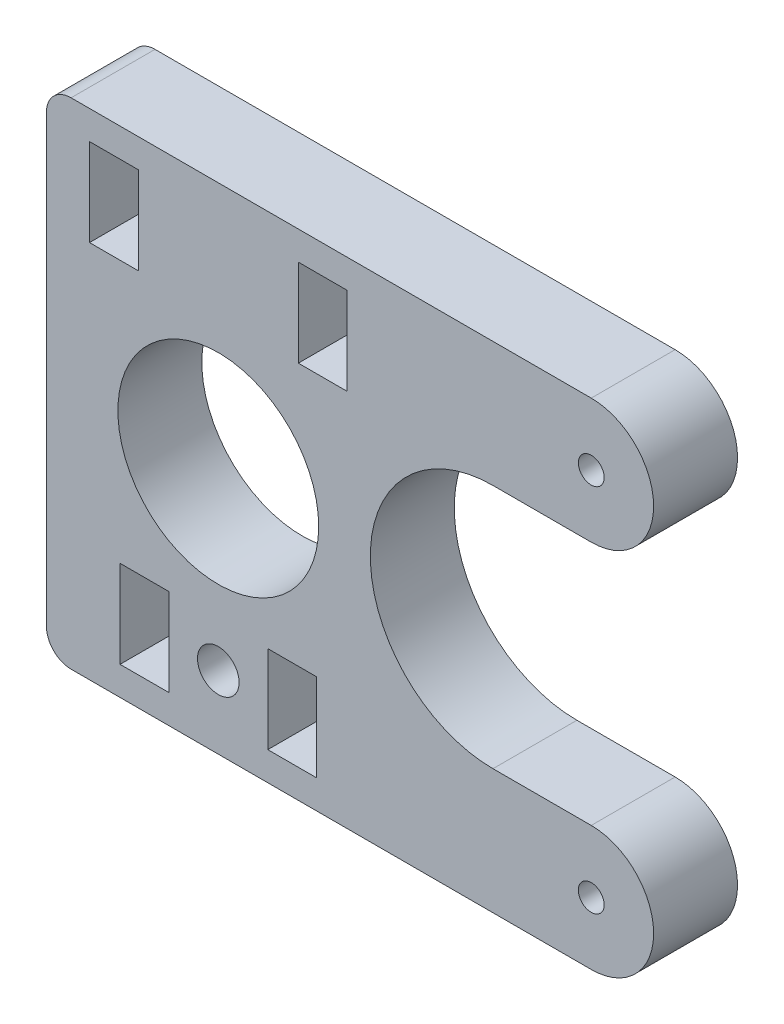
ISO-10303-21;
HEADER;
FILE_DESCRIPTION(('STEP AP214'),'2;1');
FILE_NAME('part.step','',(''),(''),'','','');
FILE_SCHEMA(('AUTOMOTIVE_DESIGN { 1 0 10303 214 1 1 1 1 }'));
ENDSEC;
DATA;
#1=APPLICATION_CONTEXT('core data for automotive mechanical design processes');
#2=APPLICATION_PROTOCOL_DEFINITION('international standard','automotive_design',2000,#1);
#3=PRODUCT_CONTEXT('',#1,'mechanical');
#4=PRODUCT('Part','Part','',(#3));
#5=PRODUCT_RELATED_PRODUCT_CATEGORY('part','',(#4));
#6=PRODUCT_DEFINITION_FORMATION('','',#4);
#7=PRODUCT_DEFINITION_CONTEXT('part definition',#1,'design');
#8=PRODUCT_DEFINITION('design','',#6,#7);
#9=PRODUCT_DEFINITION_SHAPE('','',#8);
#10=(LENGTH_UNIT() NAMED_UNIT(*) SI_UNIT(.MILLI.,.METRE.));
#11=(NAMED_UNIT(*) PLANE_ANGLE_UNIT() SI_UNIT($,.RADIAN.));
#12=(NAMED_UNIT(*) SI_UNIT($,.STERADIAN.) SOLID_ANGLE_UNIT());
#13=UNCERTAINTY_MEASURE_WITH_UNIT(LENGTH_MEASURE(1.E-05),#10,'distance_accuracy_value','');
#14=(GEOMETRIC_REPRESENTATION_CONTEXT(3) GLOBAL_UNCERTAINTY_ASSIGNED_CONTEXT((#13)) GLOBAL_UNIT_ASSIGNED_CONTEXT((#10,
#11,#12)) REPRESENTATION_CONTEXT('',''));
#15=CARTESIAN_POINT('',(0.,0.,0.));
#16=DIRECTION('',(0.,0.,1.));
#17=DIRECTION('',(1.,0.,0.));
#18=AXIS2_PLACEMENT_3D('',#15,#16,#17);
#19=CARTESIAN_POINT('',(684.72652137136,317.86545660983,5.85));
#20=DIRECTION('',(0.,0.,1.));
#21=DIRECTION('',(1.,0.,0.));
#22=AXIS2_PLACEMENT_3D('',#19,#20,#21);
#23=PLANE('',#22);
#24=DIRECTION('',(0.,1.,0.));
#25=VECTOR('',#24,1.);
#26=CARTESIAN_POINT('',(667.70653237136,339.91545660983,5.85));
#27=LINE('',#26,#25);
#28=CARTESIAN_POINT('',(667.70653237136,339.91545660983,5.85));
#29=VERTEX_POINT('',#28);
#30=CARTESIAN_POINT('',(667.70653237136,346.01545660983,5.85));
#31=VERTEX_POINT('',#30);
#32=EDGE_CURVE('E244',#29,#31,#27,.T.);
#33=ORIENTED_EDGE('',*,*,#32,.F.);
#34=DIRECTION('',(1.,0.,0.));
#35=VECTOR('',#34,1.);
#36=CARTESIAN_POINT('',(664.30652137136,339.91545660983,5.85));
#37=LINE('',#36,#35);
#38=CARTESIAN_POINT('',(664.30652137136,339.91545660983,5.85));
#39=VERTEX_POINT('',#38);
#40=EDGE_CURVE('E242',#39,#29,#37,.T.);
#41=ORIENTED_EDGE('',*,*,#40,.F.);
#42=DIRECTION('',(0.,-1.,0.));
#43=VECTOR('',#42,1.);
#44=CARTESIAN_POINT('',(664.30652137136,346.01545660983,5.85));
#45=LINE('',#44,#43);
#46=CARTESIAN_POINT('',(664.30652137136,346.01545660983,5.85));
#47=VERTEX_POINT('',#46);
#48=EDGE_CURVE('E250',#47,#39,#45,.T.);
#49=ORIENTED_EDGE('',*,*,#48,.F.);
#50=DIRECTION('',(-1.,0.,0.));
#51=VECTOR('',#50,1.);
#52=CARTESIAN_POINT('',(667.70653237136,346.01545660983,5.85));
#53=LINE('',#52,#51);
#54=EDGE_CURVE('E247',#31,#47,#53,.T.);
#55=ORIENTED_EDGE('',*,*,#54,.F.);
#56=EDGE_LOOP('',(#33,#41,#49,#55));
#57=FACE_BOUND('',#56,.T.);
#58=DIRECTION('',(0.,1.,0.));
#59=VECTOR('',#58,1.);
#60=CARTESIAN_POINT('',(653.14652137136,339.91545660983,5.85));
#61=LINE('',#60,#59);
#62=CARTESIAN_POINT('',(653.14652137136,339.91545660983,5.85));
#63=VERTEX_POINT('',#62);
#64=CARTESIAN_POINT('',(653.14652137136,346.01545660983,5.85));
#65=VERTEX_POINT('',#64);
#66=EDGE_CURVE('E306',#63,#65,#61,.T.);
#67=ORIENTED_EDGE('',*,*,#66,.F.);
#68=DIRECTION('',(1.,0.,0.));
#69=VECTOR('',#68,1.);
#70=CARTESIAN_POINT('',(649.74651037136,339.91545660983,5.85));
#71=LINE('',#70,#69);
#72=CARTESIAN_POINT('',(649.74651037136,339.91545660983,5.85));
#73=VERTEX_POINT('',#72);
#74=EDGE_CURVE('E304',#73,#63,#71,.T.);
#75=ORIENTED_EDGE('',*,*,#74,.F.);
#76=DIRECTION('',(0.,-1.,0.));
#77=VECTOR('',#76,1.);
#78=CARTESIAN_POINT('',(649.74651037136,346.01545660983,5.85));
#79=LINE('',#78,#77);
#80=CARTESIAN_POINT('',(649.74651037136,346.01545660983,5.85));
#81=VERTEX_POINT('',#80);
#82=EDGE_CURVE('E312',#81,#73,#79,.T.);
#83=ORIENTED_EDGE('',*,*,#82,.F.);
#84=DIRECTION('',(-1.,0.,0.));
#85=VECTOR('',#84,1.);
#86=CARTESIAN_POINT('',(653.14652137136,346.01545660983,5.85));
#87=LINE('',#86,#85);
#88=EDGE_CURVE('E309',#65,#81,#87,.T.);
#89=ORIENTED_EDGE('',*,*,#88,.F.);
#90=EDGE_LOOP('',(#67,#75,#83,#89));
#91=FACE_BOUND('',#90,.T.);
#92=CARTESIAN_POINT('',(658.72652137136,330.76545660983,5.85));
#93=DIRECTION('',(0.,0.,1.));
#94=DIRECTION('',(1.,0.,0.));
#95=AXIS2_PLACEMENT_3D('',#92,#93,#94);
#96=CIRCLE('',#95,7.00000000000004);
#97=CARTESIAN_POINT('',(665.72652137136,330.76545660983,5.85));
#98=VERTEX_POINT('',#97);
#99=EDGE_CURVE('E341',#98,#98,#96,.T.);
#100=ORIENTED_EDGE('',*,*,#99,.F.);
#101=EDGE_LOOP('',(#100));
#102=FACE_BOUND('',#101,.T.);
#103=CARTESIAN_POINT('',(684.72652137136,343.66545660983,5.85));
#104=DIRECTION('',(0.,0.,1.));
#105=DIRECTION('',(1.,0.,0.));
#106=AXIS2_PLACEMENT_3D('',#103,#104,#105);
#107=CIRCLE('',#106,0.900000000000007);
#108=CARTESIAN_POINT('',(685.62652137136,343.66545660983,5.85));
#109=VERTEX_POINT('',#108);
#110=EDGE_CURVE('E353',#109,#109,#107,.T.);
#111=ORIENTED_EDGE('',*,*,#110,.F.);
#112=EDGE_LOOP('',(#111));
#113=FACE_BOUND('',#112,.T.);
#114=DIRECTION('',(1.,0.,0.));
#115=VECTOR('',#114,1.);
#116=CARTESIAN_POINT('',(669.216844170212,313.51545660983,5.85));
#117=LINE('',#116,#115);
#118=CARTESIAN_POINT('',(648.463811899796,313.51545660983,5.85));
#119=VERTEX_POINT('',#118);
#120=CARTESIAN_POINT('',(684.726521371375,313.51545660983,5.85));
#121=VERTEX_POINT('',#120);
#122=EDGE_CURVE('E359',#119,#121,#117,.T.);
#123=ORIENTED_EDGE('',*,*,#122,.T.);
#124=CARTESIAN_POINT('',(684.72652137136,317.86545660983,5.85));
#125=DIRECTION('',(0.,0.,1.));
#126=DIRECTION('',(1.,0.,0.));
#127=AXIS2_PLACEMENT_3D('',#124,#125,#126);
#128=CIRCLE('',#127,4.34999999999997);
#129=CARTESIAN_POINT('',(684.726521371376,322.21545660983,5.85));
#130=VERTEX_POINT('',#129);
#131=EDGE_CURVE('E362',#121,#130,#128,.T.);
#132=ORIENTED_EDGE('',*,*,#131,.T.);
#133=DIRECTION('',(-1.,0.,0.));
#134=VECTOR('',#133,1.);
#135=CARTESIAN_POINT('',(684.726521371376,322.21545660983,5.85));
#136=LINE('',#135,#134);
#137=CARTESIAN_POINT('',(677.876521371357,322.21545660983,5.85));
#138=VERTEX_POINT('',#137);
#139=EDGE_CURVE('E365',#130,#138,#136,.T.);
#140=ORIENTED_EDGE('',*,*,#139,.T.);
#141=CARTESIAN_POINT('',(677.876521371357,330.76545660983,5.85));
#142=DIRECTION('',(0.,0.,-1.));
#143=DIRECTION('',(1.,0.,0.));
#144=AXIS2_PLACEMENT_3D('',#141,#142,#143);
#145=CIRCLE('',#144,8.55);
#146=CARTESIAN_POINT('',(677.876521371357,339.31545660983,5.85));
#147=VERTEX_POINT('',#146);
#148=EDGE_CURVE('E367',#138,#147,#145,.T.);
#149=ORIENTED_EDGE('',*,*,#148,.T.);
#150=DIRECTION('',(1.,0.,0.));
#151=VECTOR('',#150,1.);
#152=CARTESIAN_POINT('',(684.726521371376,339.31545660983,5.85));
#153=LINE('',#152,#151);
#154=CARTESIAN_POINT('',(684.726521371376,339.31545660983,5.85));
#155=VERTEX_POINT('',#154);
#156=EDGE_CURVE('E369',#147,#155,#153,.T.);
#157=ORIENTED_EDGE('',*,*,#156,.T.);
#158=CARTESIAN_POINT('',(684.72652137136,343.66545660983,5.85));
#159=DIRECTION('',(0.,0.,1.));
#160=DIRECTION('',(-1.,0.,0.));
#161=AXIS2_PLACEMENT_3D('',#158,#159,#160);
#162=CIRCLE('',#161,4.34999999999997);
#163=CARTESIAN_POINT('',(684.726521371375,348.01545660983,5.85));
#164=VERTEX_POINT('',#163);
#165=EDGE_CURVE('E371',#155,#164,#162,.T.);
#166=ORIENTED_EDGE('',*,*,#165,.T.);
#167=DIRECTION('',(-1.,0.,0.));
#168=VECTOR('',#167,1.);
#169=CARTESIAN_POINT('',(669.21684417021,348.01545660983,5.85));
#170=LINE('',#169,#168);
#171=CARTESIAN_POINT('',(648.463811899796,348.01545660983,5.85));
#172=VERTEX_POINT('',#171);
#173=EDGE_CURVE('E373',#164,#172,#170,.T.);
#174=ORIENTED_EDGE('',*,*,#173,.T.);
#175=CARTESIAN_POINT('',(648.463811899796,346.298155081394,5.85));
#176=DIRECTION('',(0.,0.,1.));
#177=DIRECTION('',(1.,0.,0.));
#178=AXIS2_PLACEMENT_3D('',#175,#176,#177);
#179=CIRCLE('',#178,1.71730152843574);
#180=CARTESIAN_POINT('',(646.74651037136,346.298155081394,5.85));
#181=VERTEX_POINT('',#180);
#182=EDGE_CURVE('E375',#172,#181,#179,.T.);
#183=ORIENTED_EDGE('',*,*,#182,.T.);
#184=DIRECTION('',(0.,-1.,0.));
#185=VECTOR('',#184,1.);
#186=CARTESIAN_POINT('',(646.74651037136,346.298155081394,5.85));
#187=LINE('',#186,#185);
#188=CARTESIAN_POINT('',(646.74651037136,315.232758138266,5.85));
#189=VERTEX_POINT('',#188);
#190=EDGE_CURVE('E377',#181,#189,#187,.T.);
#191=ORIENTED_EDGE('',*,*,#190,.T.);
#192=CARTESIAN_POINT('',(648.463811899796,315.232758138266,5.85));
#193=DIRECTION('',(0.,0.,1.));
#194=DIRECTION('',(1.,0.,0.));
#195=AXIS2_PLACEMENT_3D('',#192,#193,#194);
#196=CIRCLE('',#195,1.71730152843574);
#197=EDGE_CURVE('E379',#189,#119,#196,.T.);
#198=ORIENTED_EDGE('',*,*,#197,.T.);
#199=EDGE_LOOP('',(#123,#132,#140,#149,#157,#166,#174,#183,#191,#198));
#200=FACE_BOUND('',#199,.T.);
#201=CARTESIAN_POINT('',(658.72652137136,318.56545660983,5.85));
#202=DIRECTION('',(0.,0.,1.));
#203=DIRECTION('',(1.,0.,0.));
#204=AXIS2_PLACEMENT_3D('',#201,#202,#203);
#205=CIRCLE('',#204,1.44999999999994);
#206=CARTESIAN_POINT('',(660.17652137136,318.56545660983,5.85));
#207=VERTEX_POINT('',#206);
#208=EDGE_CURVE('E347',#207,#207,#205,.T.);
#209=ORIENTED_EDGE('',*,*,#208,.F.);
#210=EDGE_LOOP('',(#209));
#211=FACE_BOUND('',#210,.T.);
#212=CARTESIAN_POINT('',(684.72652137136,317.86545660983,5.85));
#213=DIRECTION('',(0.,0.,1.));
#214=DIRECTION('',(1.,0.,0.));
#215=AXIS2_PLACEMENT_3D('',#212,#213,#214);
#216=CIRCLE('',#215,0.900000000000007);
#217=CARTESIAN_POINT('',(685.62652137136,317.86545660983,5.85));
#218=VERTEX_POINT('',#217);
#219=EDGE_CURVE('E335',#218,#218,#216,.T.);
#220=ORIENTED_EDGE('',*,*,#219,.F.);
#221=EDGE_LOOP('',(#220));
#222=FACE_BOUND('',#221,.T.);
#223=DIRECTION('',(1.,0.,0.));
#224=VECTOR('',#223,1.);
#225=CARTESIAN_POINT('',(651.876521371361,315.51545660983,5.85));
#226=LINE('',#225,#224);
#227=CARTESIAN_POINT('',(651.876521371361,315.51545660983,5.85));
#228=VERTEX_POINT('',#227);
#229=CARTESIAN_POINT('',(655.27652137136,315.51545660983,5.85));
#230=VERTEX_POINT('',#229);
#231=EDGE_CURVE('E275',#228,#230,#226,.T.);
#232=ORIENTED_EDGE('',*,*,#231,.F.);
#233=DIRECTION('',(0.,-1.,0.));
#234=VECTOR('',#233,1.);
#235=CARTESIAN_POINT('',(651.876521371361,321.61545660983,5.85));
#236=LINE('',#235,#234);
#237=CARTESIAN_POINT('',(651.876521371361,321.61545660983,5.85));
#238=VERTEX_POINT('',#237);
#239=EDGE_CURVE('E273',#238,#228,#236,.T.);
#240=ORIENTED_EDGE('',*,*,#239,.F.);
#241=DIRECTION('',(-1.,0.,0.));
#242=VECTOR('',#241,1.);
#243=CARTESIAN_POINT('',(655.27652137136,321.61545660983,5.85));
#244=LINE('',#243,#242);
#245=CARTESIAN_POINT('',(655.27652137136,321.61545660983,5.85));
#246=VERTEX_POINT('',#245);
#247=EDGE_CURVE('E281',#246,#238,#244,.T.);
#248=ORIENTED_EDGE('',*,*,#247,.F.);
#249=DIRECTION('',(0.,1.,0.));
#250=VECTOR('',#249,1.);
#251=CARTESIAN_POINT('',(655.27652137136,315.51545660983,5.85));
#252=LINE('',#251,#250);
#253=EDGE_CURVE('E278',#230,#246,#252,.T.);
#254=ORIENTED_EDGE('',*,*,#253,.F.);
#255=EDGE_LOOP('',(#232,#240,#248,#254));
#256=FACE_BOUND('',#255,.T.);
#257=DIRECTION('',(0.,-1.,0.));
#258=VECTOR('',#257,1.);
#259=CARTESIAN_POINT('',(662.17652137136,321.61545660983,5.85));
#260=LINE('',#259,#258);
#261=CARTESIAN_POINT('',(662.17652137136,321.61545660983,5.85));
#262=VERTEX_POINT('',#261);
#263=CARTESIAN_POINT('',(662.17652137136,315.51545660983,5.85));
#264=VERTEX_POINT('',#263);
#265=EDGE_CURVE('E214',#262,#264,#260,.T.);
#266=ORIENTED_EDGE('',*,*,#265,.F.);
#267=DIRECTION('',(-1.,0.,0.));
#268=VECTOR('',#267,1.);
#269=CARTESIAN_POINT('',(665.57652137136,321.61545660983,5.85));
#270=LINE('',#269,#268);
#271=CARTESIAN_POINT('',(665.57652137136,321.61545660983,5.85));
#272=VERTEX_POINT('',#271);
#273=EDGE_CURVE('E206',#272,#262,#270,.T.);
#274=ORIENTED_EDGE('',*,*,#273,.F.);
#275=DIRECTION('',(0.,1.,0.));
#276=VECTOR('',#275,1.);
#277=CARTESIAN_POINT('',(665.57652137136,315.51545660983,5.85));
#278=LINE('',#277,#276);
#279=CARTESIAN_POINT('',(665.57652137136,315.51545660983,5.85));
#280=VERTEX_POINT('',#279);
#281=EDGE_CURVE('E228',#280,#272,#278,.T.);
#282=ORIENTED_EDGE('',*,*,#281,.F.);
#283=DIRECTION('',(1.,0.,0.));
#284=VECTOR('',#283,1.);
#285=CARTESIAN_POINT('',(662.17652137136,315.51545660983,5.85));
#286=LINE('',#285,#284);
#287=EDGE_CURVE('E226',#264,#280,#286,.T.);
#288=ORIENTED_EDGE('',*,*,#287,.F.);
#289=EDGE_LOOP('',(#266,#274,#282,#288));
#290=FACE_BOUND('',#289,.T.);
#291=ADVANCED_FACE('F33',(#57,#91,#102,#113,#200,#211,#222,#256,#290),#23,.T.);
#292=CARTESIAN_POINT('',(684.72652137136,317.86545660983,0.));
#293=DIRECTION('',(0.,0.,1.));
#294=DIRECTION('',(1.,0.,0.));
#295=AXIS2_PLACEMENT_3D('',#292,#293,#294);
#296=PLANE('',#295);
#297=DIRECTION('',(1.,0.,0.));
#298=VECTOR('',#297,1.);
#299=CARTESIAN_POINT('',(664.30652137136,339.91545660983,0.));
#300=LINE('',#299,#298);
#301=CARTESIAN_POINT('',(664.30652137136,339.91545660983,0.));
#302=VERTEX_POINT('',#301);
#303=CARTESIAN_POINT('',(667.70653237136,339.91545660983,0.));
#304=VERTEX_POINT('',#303);
#305=EDGE_CURVE('E222',#302,#304,#300,.T.);
#306=ORIENTED_EDGE('',*,*,#305,.T.);
#307=DIRECTION('',(0.,1.,0.));
#308=VECTOR('',#307,1.);
#309=CARTESIAN_POINT('',(667.70653237136,339.91545660983,0.));
#310=LINE('',#309,#308);
#311=CARTESIAN_POINT('',(667.70653237136,346.01545660983,0.));
#312=VERTEX_POINT('',#311);
#313=EDGE_CURVE('E255',#304,#312,#310,.T.);
#314=ORIENTED_EDGE('',*,*,#313,.T.);
#315=DIRECTION('',(-1.,0.,0.));
#316=VECTOR('',#315,1.);
#317=CARTESIAN_POINT('',(667.70653237136,346.01545660983,0.));
#318=LINE('',#317,#316);
#319=CARTESIAN_POINT('',(664.30652137136,346.01545660983,0.));
#320=VERTEX_POINT('',#319);
#321=EDGE_CURVE('E258',#312,#320,#318,.T.);
#322=ORIENTED_EDGE('',*,*,#321,.T.);
#323=DIRECTION('',(0.,-1.,0.));
#324=VECTOR('',#323,1.);
#325=CARTESIAN_POINT('',(664.30652137136,346.01545660983,0.));
#326=LINE('',#325,#324);
#327=EDGE_CURVE('E245',#320,#302,#326,.T.);
#328=ORIENTED_EDGE('',*,*,#327,.T.);
#329=EDGE_LOOP('',(#306,#314,#322,#328));
#330=FACE_BOUND('',#329,.T.);
#331=DIRECTION('',(1.,0.,0.));
#332=VECTOR('',#331,1.);
#333=CARTESIAN_POINT('',(649.74651037136,339.91545660983,0.));
#334=LINE('',#333,#332);
#335=CARTESIAN_POINT('',(649.74651037136,339.91545660983,0.));
#336=VERTEX_POINT('',#335);
#337=CARTESIAN_POINT('',(653.14652137136,339.91545660983,0.));
#338=VERTEX_POINT('',#337);
#339=EDGE_CURVE('E303',#336,#338,#334,.T.);
#340=ORIENTED_EDGE('',*,*,#339,.T.);
#341=DIRECTION('',(0.,1.,0.));
#342=VECTOR('',#341,1.);
#343=CARTESIAN_POINT('',(653.14652137136,339.91545660983,0.));
#344=LINE('',#343,#342);
#345=CARTESIAN_POINT('',(653.14652137136,346.01545660983,0.));
#346=VERTEX_POINT('',#345);
#347=EDGE_CURVE('E317',#338,#346,#344,.T.);
#348=ORIENTED_EDGE('',*,*,#347,.T.);
#349=DIRECTION('',(-1.,0.,0.));
#350=VECTOR('',#349,1.);
#351=CARTESIAN_POINT('',(653.14652137136,346.01545660983,0.));
#352=LINE('',#351,#350);
#353=CARTESIAN_POINT('',(649.74651037136,346.01545660983,0.));
#354=VERTEX_POINT('',#353);
#355=EDGE_CURVE('E320',#346,#354,#352,.T.);
#356=ORIENTED_EDGE('',*,*,#355,.T.);
#357=DIRECTION('',(0.,-1.,0.));
#358=VECTOR('',#357,1.);
#359=CARTESIAN_POINT('',(649.74651037136,346.01545660983,0.));
#360=LINE('',#359,#358);
#361=EDGE_CURVE('E307',#354,#336,#360,.T.);
#362=ORIENTED_EDGE('',*,*,#361,.T.);
#363=EDGE_LOOP('',(#340,#348,#356,#362));
#364=FACE_BOUND('',#363,.T.);
#365=CARTESIAN_POINT('',(658.72652137136,330.76545660983,0.));
#366=DIRECTION('',(0.,0.,1.));
#367=DIRECTION('',(1.,0.,0.));
#368=AXIS2_PLACEMENT_3D('',#365,#366,#367);
#369=CIRCLE('',#368,7.00000000000004);
#370=CARTESIAN_POINT('',(665.72652137136,330.76545660983,0.));
#371=VERTEX_POINT('',#370);
#372=EDGE_CURVE('E338',#371,#371,#369,.T.);
#373=ORIENTED_EDGE('',*,*,#372,.T.);
#374=EDGE_LOOP('',(#373));
#375=FACE_BOUND('',#374,.T.);
#376=CARTESIAN_POINT('',(684.72652137136,343.66545660983,0.));
#377=DIRECTION('',(0.,0.,1.));
#378=DIRECTION('',(1.,0.,0.));
#379=AXIS2_PLACEMENT_3D('',#376,#377,#378);
#380=CIRCLE('',#379,0.900000000000007);
#381=CARTESIAN_POINT('',(685.62652137136,343.66545660983,0.));
#382=VERTEX_POINT('',#381);
#383=EDGE_CURVE('E350',#382,#382,#380,.T.);
#384=ORIENTED_EDGE('',*,*,#383,.T.);
#385=EDGE_LOOP('',(#384));
#386=FACE_BOUND('',#385,.T.);
#387=CARTESIAN_POINT('',(684.72652137136,317.86545660983,0.));
#388=DIRECTION('',(0.,0.,1.));
#389=DIRECTION('',(1.,0.,0.));
#390=AXIS2_PLACEMENT_3D('',#387,#388,#389);
#391=CIRCLE('',#390,4.34999999999997);
#392=CARTESIAN_POINT('',(684.726521371375,313.51545660983,0.));
#393=VERTEX_POINT('',#392);
#394=CARTESIAN_POINT('',(684.726521371376,322.21545660983,0.));
#395=VERTEX_POINT('',#394);
#396=EDGE_CURVE('E356',#393,#395,#391,.T.);
#397=ORIENTED_EDGE('',*,*,#396,.F.);
#398=DIRECTION('',(1.,0.,0.));
#399=VECTOR('',#398,1.);
#400=CARTESIAN_POINT('',(648.463811899796,313.51545660983,0.));
#401=LINE('',#400,#399);
#402=CARTESIAN_POINT('',(648.463811899796,313.51545660983,0.));
#403=VERTEX_POINT('',#402);
#404=EDGE_CURVE('E363',#403,#393,#401,.T.);
#405=ORIENTED_EDGE('',*,*,#404,.F.);
#406=CARTESIAN_POINT('',(648.463811899796,315.232758138266,0.));
#407=DIRECTION('',(0.,0.,1.));
#408=DIRECTION('',(1.,0.,0.));
#409=AXIS2_PLACEMENT_3D('',#406,#407,#408);
#410=CIRCLE('',#409,1.71730152843574);
#411=CARTESIAN_POINT('',(646.74651037136,315.232758138266,0.));
#412=VERTEX_POINT('',#411);
#413=EDGE_CURVE('E399',#412,#403,#410,.T.);
#414=ORIENTED_EDGE('',*,*,#413,.F.);
#415=DIRECTION('',(0.,-1.,0.));
#416=VECTOR('',#415,1.);
#417=CARTESIAN_POINT('',(646.74651037136,346.298155081394,0.));
#418=LINE('',#417,#416);
#419=CARTESIAN_POINT('',(646.74651037136,346.298155081394,0.));
#420=VERTEX_POINT('',#419);
#421=EDGE_CURVE('E397',#420,#412,#418,.T.);
#422=ORIENTED_EDGE('',*,*,#421,.F.);
#423=CARTESIAN_POINT('',(648.463811899796,346.298155081394,0.));
#424=DIRECTION('',(0.,0.,1.));
#425=DIRECTION('',(1.,0.,0.));
#426=AXIS2_PLACEMENT_3D('',#423,#424,#425);
#427=CIRCLE('',#426,1.71730152843574);
#428=CARTESIAN_POINT('',(648.463811899796,348.01545660983,0.));
#429=VERTEX_POINT('',#428);
#430=EDGE_CURVE('E395',#429,#420,#427,.T.);
#431=ORIENTED_EDGE('',*,*,#430,.F.);
#432=DIRECTION('',(-1.,0.,0.));
#433=VECTOR('',#432,1.);
#434=CARTESIAN_POINT('',(669.21684417021,348.01545660983,0.));
#435=LINE('',#434,#433);
#436=CARTESIAN_POINT('',(684.726521371375,348.01545660983,0.));
#437=VERTEX_POINT('',#436);
#438=EDGE_CURVE('E393',#437,#429,#435,.T.);
#439=ORIENTED_EDGE('',*,*,#438,.F.);
#440=CARTESIAN_POINT('',(684.72652137136,343.66545660983,0.));
#441=DIRECTION('',(0.,0.,1.));
#442=DIRECTION('',(-1.,0.,0.));
#443=AXIS2_PLACEMENT_3D('',#440,#441,#442);
#444=CIRCLE('',#443,4.34999999999997);
#445=CARTESIAN_POINT('',(684.726521371376,339.31545660983,0.));
#446=VERTEX_POINT('',#445);
#447=EDGE_CURVE('E390',#446,#437,#444,.T.);
#448=ORIENTED_EDGE('',*,*,#447,.F.);
#449=DIRECTION('',(1.,0.,0.));
#450=VECTOR('',#449,1.);
#451=CARTESIAN_POINT('',(684.726521371376,339.31545660983,0.));
#452=LINE('',#451,#450);
#453=CARTESIAN_POINT('',(677.876521371357,339.31545660983,0.));
#454=VERTEX_POINT('',#453);
#455=EDGE_CURVE('E388',#454,#446,#452,.T.);
#456=ORIENTED_EDGE('',*,*,#455,.F.);
#457=CARTESIAN_POINT('',(677.876521371357,330.76545660983,0.));
#458=DIRECTION('',(0.,0.,-1.));
#459=DIRECTION('',(1.,0.,0.));
#460=AXIS2_PLACEMENT_3D('',#457,#458,#459);
#461=CIRCLE('',#460,8.55);
#462=CARTESIAN_POINT('',(677.876521371357,322.21545660983,0.));
#463=VERTEX_POINT('',#462);
#464=EDGE_CURVE('E386',#463,#454,#461,.T.);
#465=ORIENTED_EDGE('',*,*,#464,.F.);
#466=DIRECTION('',(-1.,0.,0.));
#467=VECTOR('',#466,1.);
#468=CARTESIAN_POINT('',(684.726521371376,322.21545660983,0.));
#469=LINE('',#468,#467);
#470=EDGE_CURVE('E384',#395,#463,#469,.T.);
#471=ORIENTED_EDGE('',*,*,#470,.F.);
#472=EDGE_LOOP('',(#397,#405,#414,#422,#431,#439,#448,#456,#465,#471));
#473=FACE_BOUND('',#472,.T.);
#474=CARTESIAN_POINT('',(658.72652137136,318.56545660983,0.));
#475=DIRECTION('',(0.,0.,1.));
#476=DIRECTION('',(1.,0.,0.));
#477=AXIS2_PLACEMENT_3D('',#474,#475,#476);
#478=CIRCLE('',#477,1.44999999999994);
#479=CARTESIAN_POINT('',(660.17652137136,318.56545660983,0.));
#480=VERTEX_POINT('',#479);
#481=EDGE_CURVE('E344',#480,#480,#478,.T.);
#482=ORIENTED_EDGE('',*,*,#481,.T.);
#483=EDGE_LOOP('',(#482));
#484=FACE_BOUND('',#483,.T.);
#485=CARTESIAN_POINT('',(684.72652137136,317.86545660983,0.));
#486=DIRECTION('',(0.,0.,1.));
#487=DIRECTION('',(1.,0.,0.));
#488=AXIS2_PLACEMENT_3D('',#485,#486,#487);
#489=CIRCLE('',#488,0.900000000000007);
#490=CARTESIAN_POINT('',(685.62652137136,317.86545660983,0.));
#491=VERTEX_POINT('',#490);
#492=EDGE_CURVE('E334',#491,#491,#489,.T.);
#493=ORIENTED_EDGE('',*,*,#492,.T.);
#494=EDGE_LOOP('',(#493));
#495=FACE_BOUND('',#494,.T.);
#496=DIRECTION('',(0.,-1.,0.));
#497=VECTOR('',#496,1.);
#498=CARTESIAN_POINT('',(651.876521371361,321.61545660983,0.));
#499=LINE('',#498,#497);
#500=CARTESIAN_POINT('',(651.876521371361,321.61545660983,0.));
#501=VERTEX_POINT('',#500);
#502=CARTESIAN_POINT('',(651.876521371361,315.51545660983,0.));
#503=VERTEX_POINT('',#502);
#504=EDGE_CURVE('E272',#501,#503,#499,.T.);
#505=ORIENTED_EDGE('',*,*,#504,.T.);
#506=DIRECTION('',(1.,0.,0.));
#507=VECTOR('',#506,1.);
#508=CARTESIAN_POINT('',(651.876521371361,315.51545660983,0.));
#509=LINE('',#508,#507);
#510=CARTESIAN_POINT('',(655.27652137136,315.51545660983,0.));
#511=VERTEX_POINT('',#510);
#512=EDGE_CURVE('E286',#503,#511,#509,.T.);
#513=ORIENTED_EDGE('',*,*,#512,.T.);
#514=DIRECTION('',(0.,1.,0.));
#515=VECTOR('',#514,1.);
#516=CARTESIAN_POINT('',(655.27652137136,315.51545660983,0.));
#517=LINE('',#516,#515);
#518=CARTESIAN_POINT('',(655.27652137136,321.61545660983,0.));
#519=VERTEX_POINT('',#518);
#520=EDGE_CURVE('E289',#511,#519,#517,.T.);
#521=ORIENTED_EDGE('',*,*,#520,.T.);
#522=DIRECTION('',(-1.,0.,0.));
#523=VECTOR('',#522,1.);
#524=CARTESIAN_POINT('',(655.27652137136,321.61545660983,0.));
#525=LINE('',#524,#523);
#526=EDGE_CURVE('E276',#519,#501,#525,.T.);
#527=ORIENTED_EDGE('',*,*,#526,.T.);
#528=EDGE_LOOP('',(#505,#513,#521,#527));
#529=FACE_BOUND('',#528,.T.);
#530=DIRECTION('',(-1.,0.,0.));
#531=VECTOR('',#530,1.);
#532=CARTESIAN_POINT('',(665.57652137136,321.61545660983,0.));
#533=LINE('',#532,#531);
#534=CARTESIAN_POINT('',(665.57652137136,321.61545660983,0.));
#535=VERTEX_POINT('',#534);
#536=CARTESIAN_POINT('',(662.17652137136,321.61545660983,0.));
#537=VERTEX_POINT('',#536);
#538=EDGE_CURVE('E56',#535,#537,#533,.T.);
#539=ORIENTED_EDGE('',*,*,#538,.T.);
#540=DIRECTION('',(0.,-1.,0.));
#541=VECTOR('',#540,1.);
#542=CARTESIAN_POINT('',(662.17652137136,321.61545660983,0.));
#543=LINE('',#542,#541);
#544=CARTESIAN_POINT('',(662.17652137136,315.51545660983,0.));
#545=VERTEX_POINT('',#544);
#546=EDGE_CURVE('E221',#537,#545,#543,.T.);
#547=ORIENTED_EDGE('',*,*,#546,.T.);
#548=DIRECTION('',(1.,0.,0.));
#549=VECTOR('',#548,1.);
#550=CARTESIAN_POINT('',(662.17652137136,315.51545660983,0.));
#551=LINE('',#550,#549);
#552=CARTESIAN_POINT('',(665.57652137136,315.51545660983,0.));
#553=VERTEX_POINT('',#552);
#554=EDGE_CURVE('E234',#545,#553,#551,.T.);
#555=ORIENTED_EDGE('',*,*,#554,.T.);
#556=DIRECTION('',(0.,1.,0.));
#557=VECTOR('',#556,1.);
#558=CARTESIAN_POINT('',(665.57652137136,315.51545660983,0.));
#559=LINE('',#558,#557);
#560=EDGE_CURVE('E215',#553,#535,#559,.T.);
#561=ORIENTED_EDGE('',*,*,#560,.T.);
#562=EDGE_LOOP('',(#539,#547,#555,#561));
#563=FACE_BOUND('',#562,.T.);
#564=ADVANCED_FACE('F435',(#330,#364,#375,#386,#473,#484,#495,#529,#563),#296,.F.);
#565=CARTESIAN_POINT('',(684.72652137136,317.86545660983,5.85));
#566=DIRECTION('',(0.,0.,-1.));
#567=DIRECTION('',(-1.,0.,0.));
#568=AXIS2_PLACEMENT_3D('',#565,#566,#567);
#569=CYLINDRICAL_SURFACE('',#568,4.34999999999997);
#570=ORIENTED_EDGE('',*,*,#396,.T.);
#571=DIRECTION('',(0.,0.,-1.));
#572=VECTOR('',#571,1.);
#573=CARTESIAN_POINT('',(684.726521371376,322.21545660983,5.85));
#574=LINE('',#573,#572);
#575=EDGE_CURVE('E41',#130,#395,#574,.T.);
#576=ORIENTED_EDGE('',*,*,#575,.F.);
#577=ORIENTED_EDGE('',*,*,#131,.F.);
#578=DIRECTION('',(0.,0.,-1.));
#579=VECTOR('',#578,1.);
#580=CARTESIAN_POINT('',(684.726521371375,313.51545660983,5.85));
#581=LINE('',#580,#579);
#582=EDGE_CURVE('E11',#121,#393,#581,.T.);
#583=ORIENTED_EDGE('',*,*,#582,.T.);
#584=EDGE_LOOP('',(#570,#576,#577,#583));
#585=FACE_BOUND('',#584,.T.);
#586=ADVANCED_FACE('F35',(#585),#569,.T.);
#587=CARTESIAN_POINT('',(684.726521371376,322.21545660983,5.85));
#588=DIRECTION('',(0.,-1.,0.));
#589=DIRECTION('',(1.,0.,0.));
#590=AXIS2_PLACEMENT_3D('',#587,#588,#589);
#591=PLANE('',#590);
#592=ORIENTED_EDGE('',*,*,#470,.T.);
#593=DIRECTION('',(0.,0.,-1.));
#594=VECTOR('',#593,1.);
#595=CARTESIAN_POINT('',(677.876521371357,322.21545660983,5.85));
#596=LINE('',#595,#594);
#597=EDGE_CURVE('E422',#138,#463,#596,.T.);
#598=ORIENTED_EDGE('',*,*,#597,.F.);
#599=ORIENTED_EDGE('',*,*,#139,.F.);
#600=ORIENTED_EDGE('',*,*,#575,.T.);
#601=EDGE_LOOP('',(#592,#598,#599,#600));
#602=FACE_BOUND('',#601,.T.);
#603=ADVANCED_FACE('F429',(#602),#591,.F.);
#604=CARTESIAN_POINT('',(677.876521371357,330.76545660983,5.85));
#605=DIRECTION('',(0.,0.,-1.));
#606=DIRECTION('',(-1.,0.,0.));
#607=AXIS2_PLACEMENT_3D('',#604,#605,#606);
#608=CYLINDRICAL_SURFACE('',#607,8.55);
#609=ORIENTED_EDGE('',*,*,#464,.T.);
#610=DIRECTION('',(0.,0.,-1.));
#611=VECTOR('',#610,1.);
#612=CARTESIAN_POINT('',(677.876521371357,339.31545660983,5.85));
#613=LINE('',#612,#611);
#614=EDGE_CURVE('E419',#147,#454,#613,.T.);
#615=ORIENTED_EDGE('',*,*,#614,.F.);
#616=ORIENTED_EDGE('',*,*,#148,.F.);
#617=ORIENTED_EDGE('',*,*,#597,.T.);
#618=EDGE_LOOP('',(#609,#615,#616,#617));
#619=FACE_BOUND('',#618,.T.);
#620=ADVANCED_FACE('F442',(#619),#608,.F.);
#621=CARTESIAN_POINT('',(684.726521371376,339.31545660983,5.85));
#622=DIRECTION('',(0.,1.,0.));
#623=DIRECTION('',(-1.,0.,0.));
#624=AXIS2_PLACEMENT_3D('',#621,#622,#623);
#625=PLANE('',#624);
#626=ORIENTED_EDGE('',*,*,#455,.T.);
#627=DIRECTION('',(0.,0.,-1.));
#628=VECTOR('',#627,1.);
#629=CARTESIAN_POINT('',(684.726521371376,339.31545660983,5.85));
#630=LINE('',#629,#628);
#631=EDGE_CURVE('E416',#155,#446,#630,.T.);
#632=ORIENTED_EDGE('',*,*,#631,.F.);
#633=ORIENTED_EDGE('',*,*,#156,.F.);
#634=ORIENTED_EDGE('',*,*,#614,.T.);
#635=EDGE_LOOP('',(#626,#632,#633,#634));
#636=FACE_BOUND('',#635,.T.);
#637=ADVANCED_FACE('F446',(#636),#625,.F.);
#638=CARTESIAN_POINT('',(684.72652137136,343.66545660983,5.85));
#639=DIRECTION('',(0.,0.,-1.));
#640=DIRECTION('',(-1.,0.,0.));
#641=AXIS2_PLACEMENT_3D('',#638,#639,#640);
#642=CYLINDRICAL_SURFACE('',#641,4.34999999999997);
#643=ORIENTED_EDGE('',*,*,#447,.T.);
#644=DIRECTION('',(0.,0.,-1.));
#645=VECTOR('',#644,1.);
#646=CARTESIAN_POINT('',(684.726521371375,348.01545660983,5.85));
#647=LINE('',#646,#645);
#648=EDGE_CURVE('E413',#164,#437,#647,.T.);
#649=ORIENTED_EDGE('',*,*,#648,.F.);
#650=ORIENTED_EDGE('',*,*,#165,.F.);
#651=ORIENTED_EDGE('',*,*,#631,.T.);
#652=EDGE_LOOP('',(#643,#649,#650,#651));
#653=FACE_BOUND('',#652,.T.);
#654=ADVANCED_FACE('F473',(#653),#642,.T.);
#655=CARTESIAN_POINT('',(669.21684417021,348.01545660983,5.85));
#656=DIRECTION('',(0.,-1.,0.));
#657=DIRECTION('',(0.,0.,-1.));
#658=AXIS2_PLACEMENT_3D('',#655,#656,#657);
#659=PLANE('',#658);
#660=ORIENTED_EDGE('',*,*,#438,.T.);
#661=DIRECTION('',(0.,0.,-1.));
#662=VECTOR('',#661,1.);
#663=CARTESIAN_POINT('',(648.463811899796,348.01545660983,5.85));
#664=LINE('',#663,#662);
#665=EDGE_CURVE('E410',#172,#429,#664,.T.);
#666=ORIENTED_EDGE('',*,*,#665,.F.);
#667=ORIENTED_EDGE('',*,*,#173,.F.);
#668=ORIENTED_EDGE('',*,*,#648,.T.);
#669=EDGE_LOOP('',(#660,#666,#667,#668));
#670=FACE_BOUND('',#669,.T.);
#671=ADVANCED_FACE('F475',(#670),#659,.F.);
#672=CARTESIAN_POINT('',(648.463811899796,346.298155081394,5.85));
#673=DIRECTION('',(0.,0.,-1.));
#674=DIRECTION('',(-1.,0.,0.));
#675=AXIS2_PLACEMENT_3D('',#672,#673,#674);
#676=CYLINDRICAL_SURFACE('',#675,1.71730152843574);
#677=ORIENTED_EDGE('',*,*,#430,.T.);
#678=DIRECTION('',(0.,0.,-1.));
#679=VECTOR('',#678,1.);
#680=CARTESIAN_POINT('',(646.74651037136,346.298155081394,5.85));
#681=LINE('',#680,#679);
#682=EDGE_CURVE('E407',#181,#420,#681,.T.);
#683=ORIENTED_EDGE('',*,*,#682,.F.);
#684=ORIENTED_EDGE('',*,*,#182,.F.);
#685=ORIENTED_EDGE('',*,*,#665,.T.);
#686=EDGE_LOOP('',(#677,#683,#684,#685));
#687=FACE_BOUND('',#686,.T.);
#688=ADVANCED_FACE('F469',(#687),#676,.T.);
#689=CARTESIAN_POINT('',(646.74651037136,346.298155081394,5.85));
#690=DIRECTION('',(1.,0.,0.));
#691=DIRECTION('',(0.,0.,-1.));
#692=AXIS2_PLACEMENT_3D('',#689,#690,#691);
#693=PLANE('',#692);
#694=ORIENTED_EDGE('',*,*,#421,.T.);
#695=DIRECTION('',(0.,0.,-1.));
#696=VECTOR('',#695,1.);
#697=CARTESIAN_POINT('',(646.74651037136,315.232758138266,5.85));
#698=LINE('',#697,#696);
#699=EDGE_CURVE('E404',#189,#412,#698,.T.);
#700=ORIENTED_EDGE('',*,*,#699,.F.);
#701=ORIENTED_EDGE('',*,*,#190,.F.);
#702=ORIENTED_EDGE('',*,*,#682,.T.);
#703=EDGE_LOOP('',(#694,#700,#701,#702));
#704=FACE_BOUND('',#703,.T.);
#705=ADVANCED_FACE('F465',(#704),#693,.F.);
#706=CARTESIAN_POINT('',(648.463811899796,315.232758138266,5.85));
#707=DIRECTION('',(0.,0.,-1.));
#708=DIRECTION('',(-1.,0.,0.));
#709=AXIS2_PLACEMENT_3D('',#706,#707,#708);
#710=CYLINDRICAL_SURFACE('',#709,1.71730152843574);
#711=ORIENTED_EDGE('',*,*,#413,.T.);
#712=DIRECTION('',(0.,0.,-1.));
#713=VECTOR('',#712,1.);
#714=CARTESIAN_POINT('',(648.463811899796,313.51545660983,5.85));
#715=LINE('',#714,#713);
#716=EDGE_CURVE('E382',#119,#403,#715,.T.);
#717=ORIENTED_EDGE('',*,*,#716,.F.);
#718=ORIENTED_EDGE('',*,*,#197,.F.);
#719=ORIENTED_EDGE('',*,*,#699,.T.);
#720=EDGE_LOOP('',(#711,#717,#718,#719));
#721=FACE_BOUND('',#720,.T.);
#722=ADVANCED_FACE('F460',(#721),#710,.T.);
#723=CARTESIAN_POINT('',(648.463811899796,313.51545660983,5.85));
#724=DIRECTION('',(0.,1.,0.));
#725=DIRECTION('',(0.,0.,1.));
#726=AXIS2_PLACEMENT_3D('',#723,#724,#725);
#727=PLANE('',#726);
#728=ORIENTED_EDGE('',*,*,#404,.T.);
#729=ORIENTED_EDGE('',*,*,#582,.F.);
#730=ORIENTED_EDGE('',*,*,#122,.F.);
#731=ORIENTED_EDGE('',*,*,#716,.T.);
#732=EDGE_LOOP('',(#728,#729,#730,#731));
#733=FACE_BOUND('',#732,.T.);
#734=ADVANCED_FACE('F454',(#733),#727,.F.);
#735=CARTESIAN_POINT('',(684.72652137136,343.66545660983,5.85));
#736=DIRECTION('',(0.,0.,-1.));
#737=DIRECTION('',(-1.,0.,0.));
#738=AXIS2_PLACEMENT_3D('',#735,#736,#737);
#739=CYLINDRICAL_SURFACE('',#738,0.900000000000007);
#740=ORIENTED_EDGE('',*,*,#110,.T.);
#741=EDGE_LOOP('',(#740));
#742=FACE_BOUND('',#741,.T.);
#743=ORIENTED_EDGE('',*,*,#383,.F.);
#744=EDGE_LOOP('',(#743));
#745=FACE_BOUND('',#744,.T.);
#746=ADVANCED_FACE('F495',(#742,#745),#739,.F.);
#747=CARTESIAN_POINT('',(658.72652137136,318.56545660983,5.85));
#748=DIRECTION('',(0.,0.,-1.));
#749=DIRECTION('',(-1.,0.,0.));
#750=AXIS2_PLACEMENT_3D('',#747,#748,#749);
#751=CYLINDRICAL_SURFACE('',#750,1.44999999999994);
#752=ORIENTED_EDGE('',*,*,#208,.T.);
#753=EDGE_LOOP('',(#752));
#754=FACE_BOUND('',#753,.T.);
#755=ORIENTED_EDGE('',*,*,#481,.F.);
#756=EDGE_LOOP('',(#755));
#757=FACE_BOUND('',#756,.T.);
#758=ADVANCED_FACE('F521',(#754,#757),#751,.F.);
#759=CARTESIAN_POINT('',(658.72652137136,330.76545660983,5.85));
#760=DIRECTION('',(0.,0.,-1.));
#761=DIRECTION('',(-1.,0.,0.));
#762=AXIS2_PLACEMENT_3D('',#759,#760,#761);
#763=CYLINDRICAL_SURFACE('',#762,7.00000000000004);
#764=ORIENTED_EDGE('',*,*,#99,.T.);
#765=EDGE_LOOP('',(#764));
#766=FACE_BOUND('',#765,.T.);
#767=ORIENTED_EDGE('',*,*,#372,.F.);
#768=EDGE_LOOP('',(#767));
#769=FACE_BOUND('',#768,.T.);
#770=ADVANCED_FACE('F528',(#766,#769),#763,.F.);
#771=CARTESIAN_POINT('',(684.72652137136,317.86545660983,5.85));
#772=DIRECTION('',(0.,0.,-1.));
#773=DIRECTION('',(-1.,0.,0.));
#774=AXIS2_PLACEMENT_3D('',#771,#772,#773);
#775=CYLINDRICAL_SURFACE('',#774,0.900000000000007);
#776=ORIENTED_EDGE('',*,*,#219,.T.);
#777=EDGE_LOOP('',(#776));
#778=FACE_BOUND('',#777,.T.);
#779=ORIENTED_EDGE('',*,*,#492,.F.);
#780=EDGE_LOOP('',(#779));
#781=FACE_BOUND('',#780,.T.);
#782=ADVANCED_FACE('F535',(#778,#781),#775,.F.);
#783=CARTESIAN_POINT('',(649.74651037136,339.91545660983,5.85));
#784=DIRECTION('',(0.,1.,0.));
#785=DIRECTION('',(0.,0.,1.));
#786=AXIS2_PLACEMENT_3D('',#783,#784,#785);
#787=PLANE('',#786);
#788=ORIENTED_EDGE('',*,*,#339,.F.);
#789=DIRECTION('',(0.,0.,-1.));
#790=VECTOR('',#789,1.);
#791=CARTESIAN_POINT('',(649.74651037136,339.91545660983,5.85));
#792=LINE('',#791,#790);
#793=EDGE_CURVE('E314',#73,#336,#792,.T.);
#794=ORIENTED_EDGE('',*,*,#793,.F.);
#795=ORIENTED_EDGE('',*,*,#74,.T.);
#796=DIRECTION('',(0.,0.,-1.));
#797=VECTOR('',#796,1.);
#798=CARTESIAN_POINT('',(653.14652137136,339.91545660983,5.85));
#799=LINE('',#798,#797);
#800=EDGE_CURVE('E331',#63,#338,#799,.T.);
#801=ORIENTED_EDGE('',*,*,#800,.T.);
#802=EDGE_LOOP('',(#788,#794,#795,#801));
#803=FACE_BOUND('',#802,.T.);
#804=ADVANCED_FACE('F543',(#803),#787,.T.);
#805=CARTESIAN_POINT('',(653.14652137136,339.91545660983,5.85));
#806=DIRECTION('',(-1.,0.,0.));
#807=DIRECTION('',(0.,0.,1.));
#808=AXIS2_PLACEMENT_3D('',#805,#806,#807);
#809=PLANE('',#808);
#810=ORIENTED_EDGE('',*,*,#347,.F.);
#811=ORIENTED_EDGE('',*,*,#800,.F.);
#812=ORIENTED_EDGE('',*,*,#66,.T.);
#813=DIRECTION('',(0.,0.,-1.));
#814=VECTOR('',#813,1.);
#815=CARTESIAN_POINT('',(653.14652137136,346.01545660983,5.85));
#816=LINE('',#815,#814);
#817=EDGE_CURVE('E329',#65,#346,#816,.T.);
#818=ORIENTED_EDGE('',*,*,#817,.T.);
#819=EDGE_LOOP('',(#810,#811,#812,#818));
#820=FACE_BOUND('',#819,.T.);
#821=ADVANCED_FACE('F551',(#820),#809,.T.);
#822=CARTESIAN_POINT('',(653.14652137136,346.01545660983,5.85));
#823=DIRECTION('',(0.,-1.,0.));
#824=DIRECTION('',(0.,0.,-1.));
#825=AXIS2_PLACEMENT_3D('',#822,#823,#824);
#826=PLANE('',#825);
#827=ORIENTED_EDGE('',*,*,#355,.F.);
#828=ORIENTED_EDGE('',*,*,#817,.F.);
#829=ORIENTED_EDGE('',*,*,#88,.T.);
#830=DIRECTION('',(0.,0.,-1.));
#831=VECTOR('',#830,1.);
#832=CARTESIAN_POINT('',(649.74651037136,346.01545660983,5.85));
#833=LINE('',#832,#831);
#834=EDGE_CURVE('E327',#81,#354,#833,.T.);
#835=ORIENTED_EDGE('',*,*,#834,.T.);
#836=EDGE_LOOP('',(#827,#828,#829,#835));
#837=FACE_BOUND('',#836,.T.);
#838=ADVANCED_FACE('F559',(#837),#826,.T.);
#839=CARTESIAN_POINT('',(649.74651037136,346.01545660983,5.85));
#840=DIRECTION('',(1.,0.,0.));
#841=DIRECTION('',(0.,0.,-1.));
#842=AXIS2_PLACEMENT_3D('',#839,#840,#841);
#843=PLANE('',#842);
#844=ORIENTED_EDGE('',*,*,#361,.F.);
#845=ORIENTED_EDGE('',*,*,#834,.F.);
#846=ORIENTED_EDGE('',*,*,#82,.T.);
#847=ORIENTED_EDGE('',*,*,#793,.T.);
#848=EDGE_LOOP('',(#844,#845,#846,#847));
#849=FACE_BOUND('',#848,.T.);
#850=ADVANCED_FACE('F567',(#849),#843,.T.);
#851=CARTESIAN_POINT('',(651.876521371361,321.61545660983,5.85));
#852=DIRECTION('',(1.,0.,0.));
#853=DIRECTION('',(0.,0.,-1.));
#854=AXIS2_PLACEMENT_3D('',#851,#852,#853);
#855=PLANE('',#854);
#856=ORIENTED_EDGE('',*,*,#504,.F.);
#857=DIRECTION('',(0.,0.,-1.));
#858=VECTOR('',#857,1.);
#859=CARTESIAN_POINT('',(651.876521371361,321.61545660983,5.85));
#860=LINE('',#859,#858);
#861=EDGE_CURVE('E283',#238,#501,#860,.T.);
#862=ORIENTED_EDGE('',*,*,#861,.F.);
#863=ORIENTED_EDGE('',*,*,#239,.T.);
#864=DIRECTION('',(0.,0.,-1.));
#865=VECTOR('',#864,1.);
#866=CARTESIAN_POINT('',(651.876521371361,315.51545660983,5.85));
#867=LINE('',#866,#865);
#868=EDGE_CURVE('E300',#228,#503,#867,.T.);
#869=ORIENTED_EDGE('',*,*,#868,.T.);
#870=EDGE_LOOP('',(#856,#862,#863,#869));
#871=FACE_BOUND('',#870,.T.);
#872=ADVANCED_FACE('F575',(#871),#855,.T.);
#873=CARTESIAN_POINT('',(651.876521371361,315.51545660983,5.85));
#874=DIRECTION('',(0.,1.,0.));
#875=DIRECTION('',(0.,0.,1.));
#876=AXIS2_PLACEMENT_3D('',#873,#874,#875);
#877=PLANE('',#876);
#878=ORIENTED_EDGE('',*,*,#512,.F.);
#879=ORIENTED_EDGE('',*,*,#868,.F.);
#880=ORIENTED_EDGE('',*,*,#231,.T.);
#881=DIRECTION('',(0.,0.,-1.));
#882=VECTOR('',#881,1.);
#883=CARTESIAN_POINT('',(655.27652137136,315.51545660983,5.85));
#884=LINE('',#883,#882);
#885=EDGE_CURVE('E298',#230,#511,#884,.T.);
#886=ORIENTED_EDGE('',*,*,#885,.T.);
#887=EDGE_LOOP('',(#878,#879,#880,#886));
#888=FACE_BOUND('',#887,.T.);
#889=ADVANCED_FACE('F583',(#888),#877,.T.);
#890=CARTESIAN_POINT('',(655.27652137136,315.51545660983,5.85));
#891=DIRECTION('',(-1.,0.,0.));
#892=DIRECTION('',(0.,0.,1.));
#893=AXIS2_PLACEMENT_3D('',#890,#891,#892);
#894=PLANE('',#893);
#895=ORIENTED_EDGE('',*,*,#520,.F.);
#896=ORIENTED_EDGE('',*,*,#885,.F.);
#897=ORIENTED_EDGE('',*,*,#253,.T.);
#898=DIRECTION('',(0.,0.,-1.));
#899=VECTOR('',#898,1.);
#900=CARTESIAN_POINT('',(655.27652137136,321.61545660983,5.85));
#901=LINE('',#900,#899);
#902=EDGE_CURVE('E296',#246,#519,#901,.T.);
#903=ORIENTED_EDGE('',*,*,#902,.T.);
#904=EDGE_LOOP('',(#895,#896,#897,#903));
#905=FACE_BOUND('',#904,.T.);
#906=ADVANCED_FACE('F591',(#905),#894,.T.);
#907=CARTESIAN_POINT('',(655.27652137136,321.61545660983,5.85));
#908=DIRECTION('',(0.,-1.,0.));
#909=DIRECTION('',(0.,0.,-1.));
#910=AXIS2_PLACEMENT_3D('',#907,#908,#909);
#911=PLANE('',#910);
#912=ORIENTED_EDGE('',*,*,#526,.F.);
#913=ORIENTED_EDGE('',*,*,#902,.F.);
#914=ORIENTED_EDGE('',*,*,#247,.T.);
#915=ORIENTED_EDGE('',*,*,#861,.T.);
#916=EDGE_LOOP('',(#912,#913,#914,#915));
#917=FACE_BOUND('',#916,.T.);
#918=ADVANCED_FACE('F599',(#917),#911,.T.);
#919=CARTESIAN_POINT('',(664.30652137136,339.91545660983,5.85));
#920=DIRECTION('',(0.,1.,0.));
#921=DIRECTION('',(-1.,0.,0.));
#922=AXIS2_PLACEMENT_3D('',#919,#920,#921);
#923=PLANE('',#922);
#924=ORIENTED_EDGE('',*,*,#305,.F.);
#925=DIRECTION('',(0.,0.,-1.));
#926=VECTOR('',#925,1.);
#927=CARTESIAN_POINT('',(664.30652137136,339.91545660983,5.85));
#928=LINE('',#927,#926);
#929=EDGE_CURVE('E252',#39,#302,#928,.T.);
#930=ORIENTED_EDGE('',*,*,#929,.F.);
#931=ORIENTED_EDGE('',*,*,#40,.T.);
#932=DIRECTION('',(0.,0.,-1.));
#933=VECTOR('',#932,1.);
#934=CARTESIAN_POINT('',(667.70653237136,339.91545660983,5.85));
#935=LINE('',#934,#933);
#936=EDGE_CURVE('E269',#29,#304,#935,.T.);
#937=ORIENTED_EDGE('',*,*,#936,.T.);
#938=EDGE_LOOP('',(#924,#930,#931,#937));
#939=FACE_BOUND('',#938,.T.);
#940=ADVANCED_FACE('F607',(#939),#923,.T.);
#941=CARTESIAN_POINT('',(667.70653237136,339.91545660983,5.85));
#942=DIRECTION('',(-1.,0.,0.));
#943=DIRECTION('',(0.,0.,1.));
#944=AXIS2_PLACEMENT_3D('',#941,#942,#943);
#945=PLANE('',#944);
#946=ORIENTED_EDGE('',*,*,#313,.F.);
#947=ORIENTED_EDGE('',*,*,#936,.F.);
#948=ORIENTED_EDGE('',*,*,#32,.T.);
#949=DIRECTION('',(0.,0.,-1.));
#950=VECTOR('',#949,1.);
#951=CARTESIAN_POINT('',(667.70653237136,346.01545660983,5.85));
#952=LINE('',#951,#950);
#953=EDGE_CURVE('E267',#31,#312,#952,.T.);
#954=ORIENTED_EDGE('',*,*,#953,.T.);
#955=EDGE_LOOP('',(#946,#947,#948,#954));
#956=FACE_BOUND('',#955,.T.);
#957=ADVANCED_FACE('F615',(#956),#945,.T.);
#958=CARTESIAN_POINT('',(667.70653237136,346.01545660983,5.85));
#959=DIRECTION('',(0.,-1.,0.));
#960=DIRECTION('',(0.,0.,-1.));
#961=AXIS2_PLACEMENT_3D('',#958,#959,#960);
#962=PLANE('',#961);
#963=ORIENTED_EDGE('',*,*,#321,.F.);
#964=ORIENTED_EDGE('',*,*,#953,.F.);
#965=ORIENTED_EDGE('',*,*,#54,.T.);
#966=DIRECTION('',(0.,0.,-1.));
#967=VECTOR('',#966,1.);
#968=CARTESIAN_POINT('',(664.30652137136,346.01545660983,5.85));
#969=LINE('',#968,#967);
#970=EDGE_CURVE('E265',#47,#320,#969,.T.);
#971=ORIENTED_EDGE('',*,*,#970,.T.);
#972=EDGE_LOOP('',(#963,#964,#965,#971));
#973=FACE_BOUND('',#972,.T.);
#974=ADVANCED_FACE('F623',(#973),#962,.T.);
#975=CARTESIAN_POINT('',(664.30652137136,346.01545660983,5.85));
#976=DIRECTION('',(1.,0.,0.));
#977=DIRECTION('',(0.,1.,0.));
#978=AXIS2_PLACEMENT_3D('',#975,#976,#977);
#979=PLANE('',#978);
#980=ORIENTED_EDGE('',*,*,#327,.F.);
#981=ORIENTED_EDGE('',*,*,#970,.F.);
#982=ORIENTED_EDGE('',*,*,#48,.T.);
#983=ORIENTED_EDGE('',*,*,#929,.T.);
#984=EDGE_LOOP('',(#980,#981,#982,#983));
#985=FACE_BOUND('',#984,.T.);
#986=ADVANCED_FACE('F631',(#985),#979,.T.);
#987=CARTESIAN_POINT('',(665.57652137136,321.61545660983,5.85));
#988=DIRECTION('',(0.,-1.,0.));
#989=DIRECTION('',(0.,0.,-1.));
#990=AXIS2_PLACEMENT_3D('',#987,#988,#989);
#991=PLANE('',#990);
#992=ORIENTED_EDGE('',*,*,#538,.F.);
#993=DIRECTION('',(0.,0.,-1.));
#994=VECTOR('',#993,1.);
#995=CARTESIAN_POINT('',(665.57652137136,321.61545660983,5.85));
#996=LINE('',#995,#994);
#997=EDGE_CURVE('E210',#272,#535,#996,.T.);
#998=ORIENTED_EDGE('',*,*,#997,.F.);
#999=ORIENTED_EDGE('',*,*,#273,.T.);
#1000=DIRECTION('',(0.,0.,-1.));
#1001=VECTOR('',#1000,1.);
#1002=CARTESIAN_POINT('',(662.17652137136,321.61545660983,5.85));
#1003=LINE('',#1002,#1001);
#1004=EDGE_CURVE('E209',#262,#537,#1003,.T.);
#1005=ORIENTED_EDGE('',*,*,#1004,.T.);
#1006=EDGE_LOOP('',(#992,#998,#999,#1005));
#1007=FACE_BOUND('',#1006,.T.);
#1008=ADVANCED_FACE('F208',(#1007),#991,.T.);
#1009=CARTESIAN_POINT('',(662.17652137136,321.61545660983,5.85));
#1010=DIRECTION('',(1.,0.,0.));
#1011=DIRECTION('',(0.,0.,-1.));
#1012=AXIS2_PLACEMENT_3D('',#1009,#1010,#1011);
#1013=PLANE('',#1012);
#1014=ORIENTED_EDGE('',*,*,#546,.F.);
#1015=ORIENTED_EDGE('',*,*,#1004,.F.);
#1016=ORIENTED_EDGE('',*,*,#265,.T.);
#1017=DIRECTION('',(0.,0.,-1.));
#1018=VECTOR('',#1017,1.);
#1019=CARTESIAN_POINT('',(662.17652137136,315.51545660983,5.85));
#1020=LINE('',#1019,#1018);
#1021=EDGE_CURVE('E223',#264,#545,#1020,.T.);
#1022=ORIENTED_EDGE('',*,*,#1021,.T.);
#1023=EDGE_LOOP('',(#1014,#1015,#1016,#1022));
#1024=FACE_BOUND('',#1023,.T.);
#1025=ADVANCED_FACE('F218',(#1024),#1013,.T.);
#1026=CARTESIAN_POINT('',(662.17652137136,315.51545660983,5.85));
#1027=DIRECTION('',(0.,1.,0.));
#1028=DIRECTION('',(0.,0.,1.));
#1029=AXIS2_PLACEMENT_3D('',#1026,#1027,#1028);
#1030=PLANE('',#1029);
#1031=ORIENTED_EDGE('',*,*,#554,.F.);
#1032=ORIENTED_EDGE('',*,*,#1021,.F.);
#1033=ORIENTED_EDGE('',*,*,#287,.T.);
#1034=DIRECTION('',(0.,0.,-1.));
#1035=VECTOR('',#1034,1.);
#1036=CARTESIAN_POINT('',(665.57652137136,315.51545660983,5.85));
#1037=LINE('',#1036,#1035);
#1038=EDGE_CURVE('E48',#280,#553,#1037,.T.);
#1039=ORIENTED_EDGE('',*,*,#1038,.T.);
#1040=EDGE_LOOP('',(#1031,#1032,#1033,#1039));
#1041=FACE_BOUND('',#1040,.T.);
#1042=ADVANCED_FACE('F652',(#1041),#1030,.T.);
#1043=CARTESIAN_POINT('',(665.57652137136,315.51545660983,5.85));
#1044=DIRECTION('',(-1.,0.,0.));
#1045=DIRECTION('',(0.,0.,1.));
#1046=AXIS2_PLACEMENT_3D('',#1043,#1044,#1045);
#1047=PLANE('',#1046);
#1048=ORIENTED_EDGE('',*,*,#560,.F.);
#1049=ORIENTED_EDGE('',*,*,#1038,.F.);
#1050=ORIENTED_EDGE('',*,*,#281,.T.);
#1051=ORIENTED_EDGE('',*,*,#997,.T.);
#1052=EDGE_LOOP('',(#1048,#1049,#1050,#1051));
#1053=FACE_BOUND('',#1052,.T.);
#1054=ADVANCED_FACE('F659',(#1053),#1047,.T.);
#1055=CLOSED_SHELL('',(#291,#564,#586,#603,#620,#637,#654,#671,#688,#705,#722,#734,#746,#758,
#770,#782,#804,#821,#838,#850,#872,#889,#906,#918,#940,#957,#974,#986,#1008,#1025,#1042,#1054));
#1056=MANIFOLD_SOLID_BREP('B2',#1055);
#1057=ADVANCED_BREP_SHAPE_REPRESENTATION('',(#18,#1056),#14);
#1058=SHAPE_DEFINITION_REPRESENTATION(#9,#1057);
ENDSEC;
END-ISO-10303-21;
